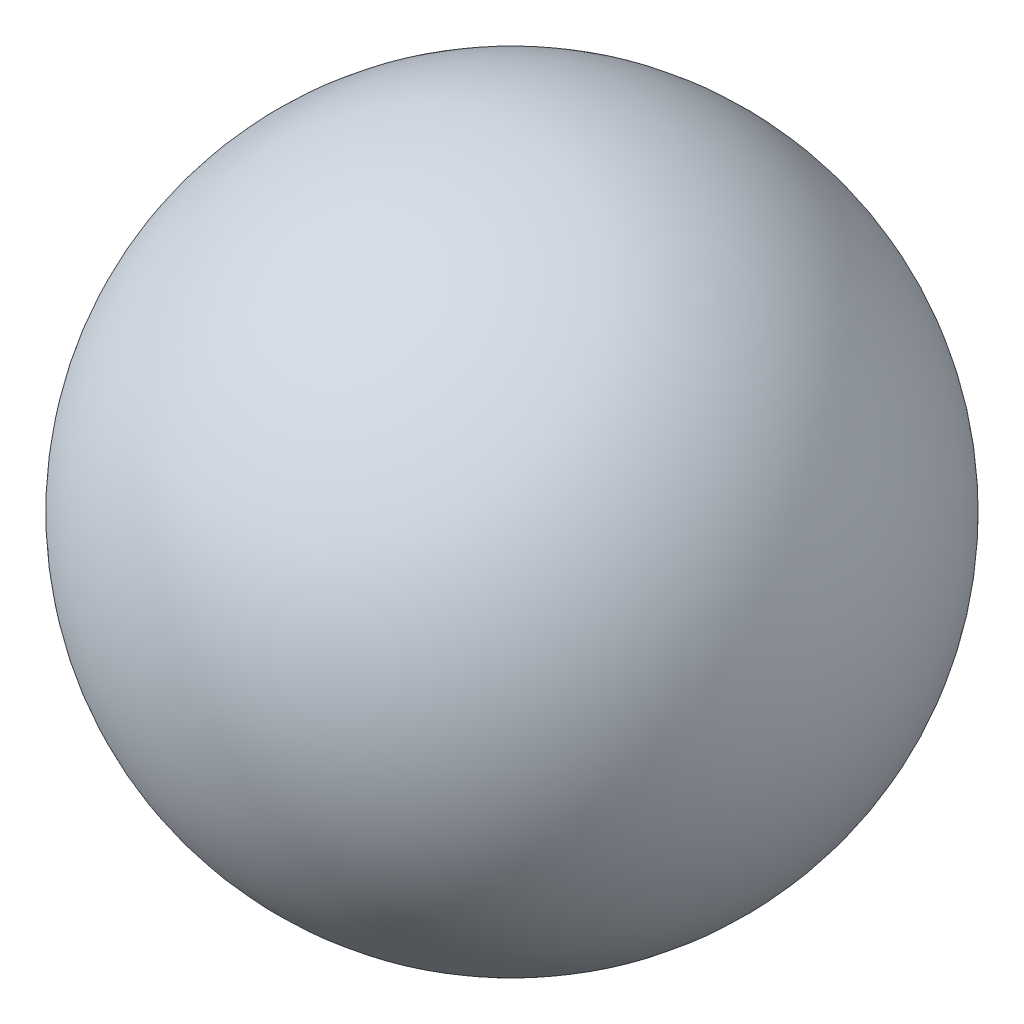
ISO-10303-21;
HEADER;
FILE_DESCRIPTION(('STEP AP214'),'2;1');
FILE_NAME('part.step','',(''),(''),'','','');
FILE_SCHEMA(('AUTOMOTIVE_DESIGN { 1 0 10303 214 1 1 1 1 }'));
ENDSEC;
DATA;
#1=APPLICATION_CONTEXT('core data for automotive mechanical design processes');
#2=APPLICATION_PROTOCOL_DEFINITION('international standard','automotive_design',2000,#1);
#3=PRODUCT_CONTEXT('',#1,'mechanical');
#4=PRODUCT('Part','Part','',(#3));
#5=PRODUCT_RELATED_PRODUCT_CATEGORY('part','',(#4));
#6=PRODUCT_DEFINITION_FORMATION('','',#4);
#7=PRODUCT_DEFINITION_CONTEXT('part definition',#1,'design');
#8=PRODUCT_DEFINITION('design','',#6,#7);
#9=PRODUCT_DEFINITION_SHAPE('','',#8);
#10=(LENGTH_UNIT() NAMED_UNIT(*) SI_UNIT(.MILLI.,.METRE.));
#11=(NAMED_UNIT(*) PLANE_ANGLE_UNIT() SI_UNIT($,.RADIAN.));
#12=(NAMED_UNIT(*) SI_UNIT($,.STERADIAN.) SOLID_ANGLE_UNIT());
#13=UNCERTAINTY_MEASURE_WITH_UNIT(LENGTH_MEASURE(1.E-05),#10,'distance_accuracy_value','');
#14=(GEOMETRIC_REPRESENTATION_CONTEXT(3) GLOBAL_UNCERTAINTY_ASSIGNED_CONTEXT((#13)) GLOBAL_UNIT_ASSIGNED_CONTEXT((#10,
#11,#12)) REPRESENTATION_CONTEXT('',''));
#15=CARTESIAN_POINT('',(0.,0.,0.));
#16=DIRECTION('',(0.,0.,1.));
#17=DIRECTION('',(1.,0.,0.));
#18=AXIS2_PLACEMENT_3D('',#15,#16,#17);
#19=CARTESIAN_POINT('',(0.,0.,0.));
#20=DIRECTION('',(0.,-1.,0.));
#21=DIRECTION('',(1.,0.,0.));
#22=AXIS2_PLACEMENT_3D('',#19,#20,#21);
#23=SPHERICAL_SURFACE('',#22,303.);
#24=CARTESIAN_POINT('',(0.,-303.,0.));
#25=VERTEX_POINT('',#24);
#26=VERTEX_LOOP('',#25);
#27=FACE_BOUND('',#26,.T.);
#28=ADVANCED_FACE('F33',(#27),#23,.T.);
#29=CLOSED_SHELL('',(#28));
#30=CARTESIAN_POINT('',(0.,0.,0.));
#31=DIRECTION('',(0.,-1.,0.));
#32=DIRECTION('',(-1.,0.,0.));
#33=AXIS2_PLACEMENT_3D('',#30,#31,#32);
#34=SPHERICAL_SURFACE('',#33,299.);
#35=CARTESIAN_POINT('',(0.,-299.,0.));
#36=VERTEX_POINT('',#35);
#37=VERTEX_LOOP('',#36);
#38=FACE_BOUND('',#37,.T.);
#39=ADVANCED_FACE('F45',(#38),#34,.F.);
#40=CLOSED_SHELL('',(#39));
#41=ORIENTED_CLOSED_SHELL('',*,#40,.T.);
#42=BREP_WITH_VOIDS('B2',#29,(#41));
#43=ADVANCED_BREP_SHAPE_REPRESENTATION('',(#18,#42),#14);
#44=SHAPE_DEFINITION_REPRESENTATION(#9,#43);
ENDSEC;
END-ISO-10303-21;
